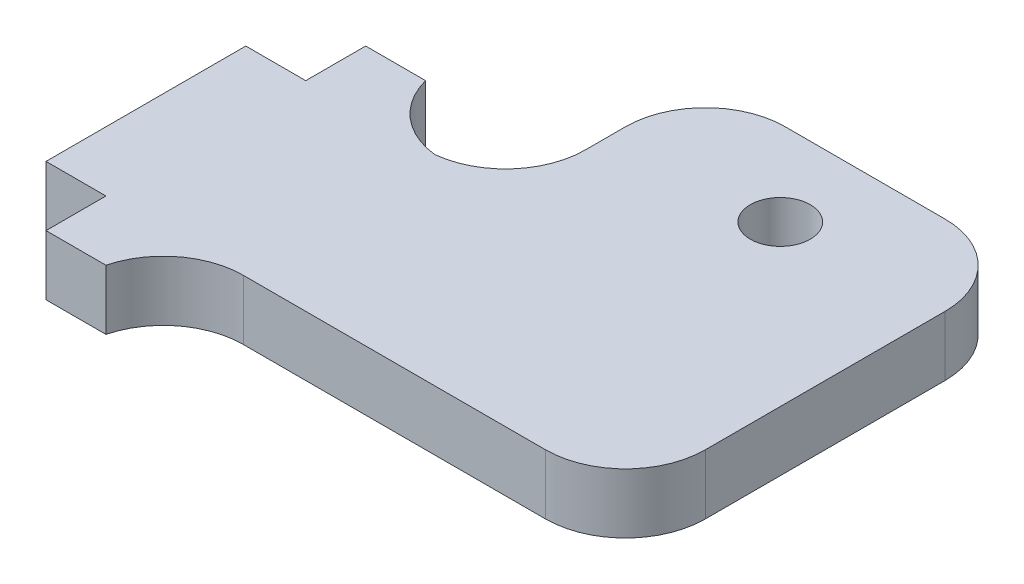
ISO-10303-21;
HEADER;
FILE_DESCRIPTION(('STEP AP214'),'2;1');
FILE_NAME('part.step','',(''),(''),'','','');
FILE_SCHEMA(('AUTOMOTIVE_DESIGN { 1 0 10303 214 1 1 1 1 }'));
ENDSEC;
DATA;
#1=APPLICATION_CONTEXT('core data for automotive mechanical design processes');
#2=APPLICATION_PROTOCOL_DEFINITION('international standard','automotive_design',2000,#1);
#3=PRODUCT_CONTEXT('',#1,'mechanical');
#4=PRODUCT('Part','Part','',(#3));
#5=PRODUCT_RELATED_PRODUCT_CATEGORY('part','',(#4));
#6=PRODUCT_DEFINITION_FORMATION('','',#4);
#7=PRODUCT_DEFINITION_CONTEXT('part definition',#1,'design');
#8=PRODUCT_DEFINITION('design','',#6,#7);
#9=PRODUCT_DEFINITION_SHAPE('','',#8);
#10=(LENGTH_UNIT() NAMED_UNIT(*) SI_UNIT(.MILLI.,.METRE.));
#11=(NAMED_UNIT(*) PLANE_ANGLE_UNIT() SI_UNIT($,.RADIAN.));
#12=(NAMED_UNIT(*) SI_UNIT($,.STERADIAN.) SOLID_ANGLE_UNIT());
#13=UNCERTAINTY_MEASURE_WITH_UNIT(LENGTH_MEASURE(1.E-05),#10,'distance_accuracy_value','');
#14=(GEOMETRIC_REPRESENTATION_CONTEXT(3) GLOBAL_UNCERTAINTY_ASSIGNED_CONTEXT((#13)) GLOBAL_UNIT_ASSIGNED_CONTEXT((#10,
#11,#12)) REPRESENTATION_CONTEXT('',''));
#15=CARTESIAN_POINT('',(0.,0.,0.));
#16=DIRECTION('',(0.,0.,1.));
#17=DIRECTION('',(1.,0.,0.));
#18=AXIS2_PLACEMENT_3D('',#15,#16,#17);
#19=CARTESIAN_POINT('',(-1.5,3.,0.));
#20=DIRECTION('',(1.,0.,0.));
#21=DIRECTION('',(0.,0.,-1.));
#22=AXIS2_PLACEMENT_3D('',#19,#20,#21);
#23=PLANE('',#22);
#24=DIRECTION('',(0.,0.,1.));
#25=VECTOR('',#24,1.);
#26=CARTESIAN_POINT('',(-1.5,0.,0.));
#27=LINE('',#26,#25);
#28=CARTESIAN_POINT('',(-1.5,0.,-6.));
#29=VERTEX_POINT('',#28);
#30=CARTESIAN_POINT('',(-1.5,0.,-4.));
#31=VERTEX_POINT('',#30);
#32=EDGE_CURVE('E246',#29,#31,#27,.T.);
#33=ORIENTED_EDGE('',*,*,#32,.T.);
#34=DIRECTION('',(0.,-1.,0.));
#35=VECTOR('',#34,1.);
#36=CARTESIAN_POINT('',(-1.5,3.,-4.));
#37=LINE('',#36,#35);
#38=CARTESIAN_POINT('',(-1.5,3.,-4.));
#39=VERTEX_POINT('',#38);
#40=EDGE_CURVE('E291',#31,#39,#37,.F.);
#41=ORIENTED_EDGE('',*,*,#40,.T.);
#42=DIRECTION('',(0.,0.,1.));
#43=VECTOR('',#42,1.);
#44=CARTESIAN_POINT('',(-1.5,3.,0.));
#45=LINE('',#44,#43);
#46=CARTESIAN_POINT('',(-1.5,3.,-6.));
#47=VERTEX_POINT('',#46);
#48=EDGE_CURVE('E222',#47,#39,#45,.T.);
#49=ORIENTED_EDGE('',*,*,#48,.F.);
#50=DIRECTION('',(0.,-1.,0.));
#51=VECTOR('',#50,1.);
#52=CARTESIAN_POINT('',(-1.5,0.,-6.));
#53=LINE('',#52,#51);
#54=EDGE_CURVE('E276',#47,#29,#53,.T.);
#55=ORIENTED_EDGE('',*,*,#54,.T.);
#56=EDGE_LOOP('',(#33,#41,#49,#55));
#57=FACE_BOUND('',#56,.T.);
#58=ADVANCED_FACE('F75',(#57),#23,.F.);
#59=CARTESIAN_POINT('',(0.,3.,0.));
#60=DIRECTION('',(0.,0.,-1.));
#61=DIRECTION('',(-1.,0.,0.));
#62=AXIS2_PLACEMENT_3D('',#59,#60,#61);
#63=PLANE('',#62);
#64=DIRECTION('',(1.,0.,0.));
#65=VECTOR('',#64,1.);
#66=CARTESIAN_POINT('',(0.,3.,0.));
#67=LINE('',#66,#65);
#68=CARTESIAN_POINT('',(-14.5,3.,0.));
#69=VERTEX_POINT('',#68);
#70=CARTESIAN_POINT('',(-11.5,3.,0.));
#71=VERTEX_POINT('',#70);
#72=EDGE_CURVE('E199',#69,#71,#67,.T.);
#73=ORIENTED_EDGE('',*,*,#72,.T.);
#74=DIRECTION('',(0.,-1.,0.));
#75=VECTOR('',#74,1.);
#76=CARTESIAN_POINT('',(-11.5,3.,0.));
#77=LINE('',#76,#75);
#78=CARTESIAN_POINT('',(-11.5,0.,0.));
#79=VERTEX_POINT('',#78);
#80=EDGE_CURVE('E205',#71,#79,#77,.T.);
#81=ORIENTED_EDGE('',*,*,#80,.T.);
#82=DIRECTION('',(1.,0.,0.));
#83=VECTOR('',#82,1.);
#84=CARTESIAN_POINT('',(0.,0.,0.));
#85=LINE('',#84,#83);
#86=CARTESIAN_POINT('',(-14.5,0.,0.));
#87=VERTEX_POINT('',#86);
#88=EDGE_CURVE('E201',#87,#79,#85,.T.);
#89=ORIENTED_EDGE('',*,*,#88,.F.);
#90=DIRECTION('',(0.,-1.,0.));
#91=VECTOR('',#90,1.);
#92=CARTESIAN_POINT('',(-14.5,3.,0.));
#93=LINE('',#92,#91);
#94=EDGE_CURVE('E195',#69,#87,#93,.T.);
#95=ORIENTED_EDGE('',*,*,#94,.F.);
#96=EDGE_LOOP('',(#73,#81,#89,#95));
#97=FACE_BOUND('',#96,.T.);
#98=ADVANCED_FACE('F197',(#97),#63,.T.);
#99=CARTESIAN_POINT('',(-14.5,3.,0.));
#100=DIRECTION('',(1.,0.,0.));
#101=DIRECTION('',(0.,0.,-1.));
#102=AXIS2_PLACEMENT_3D('',#99,#100,#101);
#103=PLANE('',#102);
#104=DIRECTION('',(0.,0.,1.));
#105=VECTOR('',#104,1.);
#106=CARTESIAN_POINT('',(-14.5,0.,0.));
#107=LINE('',#106,#105);
#108=CARTESIAN_POINT('',(-14.5,0.,10.));
#109=VERTEX_POINT('',#108);
#110=EDGE_CURVE('E250',#87,#109,#107,.T.);
#111=ORIENTED_EDGE('',*,*,#110,.T.);
#112=DIRECTION('',(0.,-1.,0.));
#113=VECTOR('',#112,1.);
#114=CARTESIAN_POINT('',(-14.5,3.,10.));
#115=LINE('',#114,#113);
#116=CARTESIAN_POINT('',(-14.5,3.,10.));
#117=VERTEX_POINT('',#116);
#118=EDGE_CURVE('E206',#117,#109,#115,.T.);
#119=ORIENTED_EDGE('',*,*,#118,.F.);
#120=DIRECTION('',(0.,0.,1.));
#121=VECTOR('',#120,1.);
#122=CARTESIAN_POINT('',(-14.5,3.,0.));
#123=LINE('',#122,#121);
#124=EDGE_CURVE('E210',#69,#117,#123,.T.);
#125=ORIENTED_EDGE('',*,*,#124,.F.);
#126=ORIENTED_EDGE('',*,*,#94,.T.);
#127=EDGE_LOOP('',(#111,#119,#125,#126));
#128=FACE_BOUND('',#127,.T.);
#129=ADVANCED_FACE('F211',(#128),#103,.F.);
#130=CARTESIAN_POINT('',(0.,3.,10.));
#131=DIRECTION('',(0.,0.,-1.));
#132=DIRECTION('',(-1.,0.,0.));
#133=AXIS2_PLACEMENT_3D('',#130,#131,#132);
#134=PLANE('',#133);
#135=DIRECTION('',(1.,0.,0.));
#136=VECTOR('',#135,1.);
#137=CARTESIAN_POINT('',(0.,0.,10.));
#138=LINE('',#137,#136);
#139=CARTESIAN_POINT('',(-11.5,0.,10.));
#140=VERTEX_POINT('',#139);
#141=EDGE_CURVE('E252',#109,#140,#138,.T.);
#142=ORIENTED_EDGE('',*,*,#141,.T.);
#143=DIRECTION('',(0.,-1.,0.));
#144=VECTOR('',#143,1.);
#145=CARTESIAN_POINT('',(-11.5,3.,10.));
#146=LINE('',#145,#144);
#147=CARTESIAN_POINT('',(-11.5,3.,10.));
#148=VERTEX_POINT('',#147);
#149=EDGE_CURVE('E271',#148,#140,#146,.T.);
#150=ORIENTED_EDGE('',*,*,#149,.F.);
#151=DIRECTION('',(1.,0.,0.));
#152=VECTOR('',#151,1.);
#153=CARTESIAN_POINT('',(0.,3.,10.));
#154=LINE('',#153,#152);
#155=EDGE_CURVE('E214',#117,#148,#154,.T.);
#156=ORIENTED_EDGE('',*,*,#155,.F.);
#157=ORIENTED_EDGE('',*,*,#118,.T.);
#158=EDGE_LOOP('',(#142,#150,#156,#157));
#159=FACE_BOUND('',#158,.T.);
#160=ADVANCED_FACE('F426',(#159),#134,.F.);
#161=CARTESIAN_POINT('',(-11.5,3.,0.));
#162=DIRECTION('',(1.,0.,0.));
#163=DIRECTION('',(0.,0.,-1.));
#164=AXIS2_PLACEMENT_3D('',#161,#162,#163);
#165=PLANE('',#164);
#166=DIRECTION('',(0.,0.,1.));
#167=VECTOR('',#166,1.);
#168=CARTESIAN_POINT('',(-11.5,0.,0.));
#169=LINE('',#168,#167);
#170=CARTESIAN_POINT('',(-11.5,0.,13.));
#171=VERTEX_POINT('',#170);
#172=EDGE_CURVE('E255',#140,#171,#169,.T.);
#173=ORIENTED_EDGE('',*,*,#172,.T.);
#174=DIRECTION('',(0.,-1.,0.));
#175=VECTOR('',#174,1.);
#176=CARTESIAN_POINT('',(-11.5,3.,13.));
#177=LINE('',#176,#175);
#178=CARTESIAN_POINT('',(-11.5,3.,13.));
#179=VERTEX_POINT('',#178);
#180=EDGE_CURVE('E268',#179,#171,#177,.T.);
#181=ORIENTED_EDGE('',*,*,#180,.F.);
#182=DIRECTION('',(0.,0.,1.));
#183=VECTOR('',#182,1.);
#184=CARTESIAN_POINT('',(-11.5,3.,0.));
#185=LINE('',#184,#183);
#186=EDGE_CURVE('E229',#148,#179,#185,.T.);
#187=ORIENTED_EDGE('',*,*,#186,.F.);
#188=ORIENTED_EDGE('',*,*,#149,.T.);
#189=EDGE_LOOP('',(#173,#181,#187,#188));
#190=FACE_BOUND('',#189,.T.);
#191=ADVANCED_FACE('F428',(#190),#165,.F.);
#192=CARTESIAN_POINT('',(0.,3.,13.));
#193=DIRECTION('',(0.,0.,-1.));
#194=DIRECTION('',(-1.,0.,0.));
#195=AXIS2_PLACEMENT_3D('',#192,#193,#194);
#196=PLANE('',#195);
#197=DIRECTION('',(1.,0.,0.));
#198=VECTOR('',#197,1.);
#199=CARTESIAN_POINT('',(0.,0.,13.));
#200=LINE('',#199,#198);
#201=CARTESIAN_POINT('',(-8.5,0.,13.));
#202=VERTEX_POINT('',#201);
#203=EDGE_CURVE('E259',#171,#202,#200,.T.);
#204=ORIENTED_EDGE('',*,*,#203,.T.);
#205=DIRECTION('',(0.,-1.,0.));
#206=VECTOR('',#205,1.);
#207=CARTESIAN_POINT('',(-8.5,3.,13.));
#208=LINE('',#207,#206);
#209=CARTESIAN_POINT('',(-8.5,3.,13.));
#210=VERTEX_POINT('',#209);
#211=EDGE_CURVE('E238',#210,#202,#208,.T.);
#212=ORIENTED_EDGE('',*,*,#211,.F.);
#213=DIRECTION('',(1.,0.,0.));
#214=VECTOR('',#213,1.);
#215=CARTESIAN_POINT('',(0.,3.,13.));
#216=LINE('',#215,#214);
#217=EDGE_CURVE('E233',#179,#210,#216,.T.);
#218=ORIENTED_EDGE('',*,*,#217,.F.);
#219=ORIENTED_EDGE('',*,*,#180,.T.);
#220=EDGE_LOOP('',(#204,#212,#218,#219));
#221=FACE_BOUND('',#220,.T.);
#222=ADVANCED_FACE('F334',(#221),#196,.F.);
#223=CARTESIAN_POINT('',(-4.62701665379258,3.,10.));
#224=VERTEX_POINT('',#223);
#225=CARTESIAN_POINT('',(10.5,3.,10.));
#226=VERTEX_POINT('',#225);
#227=EDGE_CURVE('E230',#224,#226,#154,.T.);
#228=ORIENTED_EDGE('',*,*,#227,.F.);
#229=DIRECTION('',(0.,1.,0.));
#230=VECTOR('',#229,1.);
#231=CARTESIAN_POINT('',(-4.62701665379258,3.,10.));
#232=LINE('',#231,#230);
#233=CARTESIAN_POINT('',(-4.62701665379258,0.,10.));
#234=VERTEX_POINT('',#233);
#235=EDGE_CURVE('E296',#224,#234,#232,.F.);
#236=ORIENTED_EDGE('',*,*,#235,.T.);
#237=CARTESIAN_POINT('',(10.5,0.,10.));
#238=VERTEX_POINT('',#237);
#239=EDGE_CURVE('E256',#234,#238,#138,.T.);
#240=ORIENTED_EDGE('',*,*,#239,.T.);
#241=DIRECTION('',(0.,-1.,0.));
#242=VECTOR('',#241,1.);
#243=CARTESIAN_POINT('',(10.5,3.,10.));
#244=LINE('',#243,#242);
#245=EDGE_CURVE('E294',#238,#226,#244,.F.);
#246=ORIENTED_EDGE('',*,*,#245,.T.);
#247=EDGE_LOOP('',(#228,#236,#240,#246));
#248=FACE_BOUND('',#247,.T.);
#249=ADVANCED_FACE('F341',(#248),#134,.F.);
#250=CARTESIAN_POINT('',(14.5,3.,0.));
#251=DIRECTION('',(1.,0.,0.));
#252=DIRECTION('',(0.,0.,-1.));
#253=AXIS2_PLACEMENT_3D('',#250,#251,#252);
#254=PLANE('',#253);
#255=DIRECTION('',(0.,0.,1.));
#256=VECTOR('',#255,1.);
#257=CARTESIAN_POINT('',(14.5,3.,0.));
#258=LINE('',#257,#256);
#259=CARTESIAN_POINT('',(14.5,3.,-6.));
#260=VERTEX_POINT('',#259);
#261=CARTESIAN_POINT('',(14.5,3.,6.));
#262=VERTEX_POINT('',#261);
#263=EDGE_CURVE('E235',#260,#262,#258,.T.);
#264=ORIENTED_EDGE('',*,*,#263,.T.);
#265=DIRECTION('',(0.,-1.,0.));
#266=VECTOR('',#265,1.);
#267=CARTESIAN_POINT('',(14.5,0.,6.));
#268=LINE('',#267,#266);
#269=CARTESIAN_POINT('',(14.5,0.,6.));
#270=VERTEX_POINT('',#269);
#271=EDGE_CURVE('E301',#262,#270,#268,.T.);
#272=ORIENTED_EDGE('',*,*,#271,.T.);
#273=DIRECTION('',(0.,0.,1.));
#274=VECTOR('',#273,1.);
#275=CARTESIAN_POINT('',(14.5,0.,0.));
#276=LINE('',#275,#274);
#277=CARTESIAN_POINT('',(14.5,0.,-6.));
#278=VERTEX_POINT('',#277);
#279=EDGE_CURVE('E262',#278,#270,#276,.T.);
#280=ORIENTED_EDGE('',*,*,#279,.F.);
#281=DIRECTION('',(0.,-1.,0.));
#282=VECTOR('',#281,1.);
#283=CARTESIAN_POINT('',(14.5,3.,-6.));
#284=LINE('',#283,#282);
#285=EDGE_CURVE('E299',#278,#260,#284,.F.);
#286=ORIENTED_EDGE('',*,*,#285,.T.);
#287=EDGE_LOOP('',(#264,#272,#280,#286));
#288=FACE_BOUND('',#287,.T.);
#289=ADVANCED_FACE('F349',(#288),#254,.T.);
#290=CARTESIAN_POINT('',(0.,3.,-10.));
#291=DIRECTION('',(0.,0.,-1.));
#292=DIRECTION('',(-1.,0.,0.));
#293=AXIS2_PLACEMENT_3D('',#290,#291,#292);
#294=PLANE('',#293);
#295=DIRECTION('',(1.,0.,0.));
#296=VECTOR('',#295,1.);
#297=CARTESIAN_POINT('',(0.,3.,-10.));
#298=LINE('',#297,#296);
#299=CARTESIAN_POINT('',(2.5,3.,-10.));
#300=VERTEX_POINT('',#299);
#301=CARTESIAN_POINT('',(10.5,3.,-10.));
#302=VERTEX_POINT('',#301);
#303=EDGE_CURVE('E224',#300,#302,#298,.T.);
#304=ORIENTED_EDGE('',*,*,#303,.T.);
#305=DIRECTION('',(0.,-1.,0.));
#306=VECTOR('',#305,1.);
#307=CARTESIAN_POINT('',(10.5,3.,-10.));
#308=LINE('',#307,#306);
#309=CARTESIAN_POINT('',(10.5,0.,-10.));
#310=VERTEX_POINT('',#309);
#311=EDGE_CURVE('E318',#302,#310,#308,.T.);
#312=ORIENTED_EDGE('',*,*,#311,.T.);
#313=DIRECTION('',(1.,0.,0.));
#314=VECTOR('',#313,1.);
#315=CARTESIAN_POINT('',(0.,0.,-10.));
#316=LINE('',#315,#314);
#317=CARTESIAN_POINT('',(2.5,0.,-10.));
#318=VERTEX_POINT('',#317);
#319=EDGE_CURVE('E242',#318,#310,#316,.T.);
#320=ORIENTED_EDGE('',*,*,#319,.F.);
#321=DIRECTION('',(0.,-1.,0.));
#322=VECTOR('',#321,1.);
#323=CARTESIAN_POINT('',(2.5,3.,-10.));
#324=LINE('',#323,#322);
#325=EDGE_CURVE('E316',#318,#300,#324,.F.);
#326=ORIENTED_EDGE('',*,*,#325,.T.);
#327=EDGE_LOOP('',(#304,#312,#320,#326));
#328=FACE_BOUND('',#327,.T.);
#329=ADVANCED_FACE('F359',(#328),#294,.T.);
#330=CARTESIAN_POINT('',(6.5,3.,-5.75));
#331=DIRECTION('',(0.,-1.,0.));
#332=DIRECTION('',(0.,0.,-1.));
#333=AXIS2_PLACEMENT_3D('',#330,#331,#332);
#334=CYLINDRICAL_SURFACE('',#333,1.5);
#335=CARTESIAN_POINT('',(6.5,3.,-5.75));
#336=DIRECTION('',(0.,1.,0.));
#337=DIRECTION('',(0.,0.,1.));
#338=AXIS2_PLACEMENT_3D('',#335,#336,#337);
#339=CIRCLE('',#338,1.5);
#340=CARTESIAN_POINT('',(6.5,3.,-4.25));
#341=VERTEX_POINT('',#340);
#342=EDGE_CURVE('E265',#341,#341,#339,.T.);
#343=ORIENTED_EDGE('',*,*,#342,.T.);
#344=EDGE_LOOP('',(#343));
#345=FACE_BOUND('',#344,.T.);
#346=CARTESIAN_POINT('',(6.5,0.,-5.75));
#347=DIRECTION('',(0.,1.,0.));
#348=DIRECTION('',(0.,0.,1.));
#349=AXIS2_PLACEMENT_3D('',#346,#347,#348);
#350=CIRCLE('',#349,1.5);
#351=CARTESIAN_POINT('',(6.5,0.,-4.25));
#352=VERTEX_POINT('',#351);
#353=EDGE_CURVE('E239',#352,#352,#350,.T.);
#354=ORIENTED_EDGE('',*,*,#353,.F.);
#355=EDGE_LOOP('',(#354));
#356=FACE_BOUND('',#355,.T.);
#357=ADVANCED_FACE('F366',(#345,#356),#334,.F.);
#358=CARTESIAN_POINT('',(0.,0.,0.));
#359=DIRECTION('',(0.,1.,0.));
#360=DIRECTION('',(0.,0.,1.));
#361=AXIS2_PLACEMENT_3D('',#358,#359,#360);
#362=PLANE('',#361);
#363=ORIENTED_EDGE('',*,*,#353,.T.);
#364=EDGE_LOOP('',(#363));
#365=FACE_BOUND('',#364,.T.);
#366=ORIENTED_EDGE('',*,*,#279,.T.);
#367=CARTESIAN_POINT('',(10.5,0.,6.));
#368=DIRECTION('',(0.,1.,0.));
#369=DIRECTION('',(0.,0.,1.));
#370=AXIS2_PLACEMENT_3D('',#367,#368,#369);
#371=CIRCLE('',#370,4.);
#372=EDGE_CURVE('E308',#270,#238,#371,.F.);
#373=ORIENTED_EDGE('',*,*,#372,.T.);
#374=ORIENTED_EDGE('',*,*,#239,.F.);
#375=CARTESIAN_POINT('',(-4.62701665379258,0.,14.));
#376=DIRECTION('',(0.,1.,0.));
#377=DIRECTION('',(0.,0.,1.));
#378=AXIS2_PLACEMENT_3D('',#375,#376,#377);
#379=CIRCLE('',#378,4.);
#380=EDGE_CURVE('E84',#234,#202,#379,.T.);
#381=ORIENTED_EDGE('',*,*,#380,.T.);
#382=ORIENTED_EDGE('',*,*,#203,.F.);
#383=ORIENTED_EDGE('',*,*,#172,.F.);
#384=ORIENTED_EDGE('',*,*,#141,.F.);
#385=ORIENTED_EDGE('',*,*,#110,.F.);
#386=ORIENTED_EDGE('',*,*,#88,.T.);
#387=DIRECTION('',(0.,0.,1.));
#388=VECTOR('',#387,1.);
#389=CARTESIAN_POINT('',(-11.5,0.,-3.));
#390=LINE('',#389,#388);
#391=CARTESIAN_POINT('',(-11.5,0.,-3.));
#392=VERTEX_POINT('',#391);
#393=EDGE_CURVE('E283',#392,#79,#390,.T.);
#394=ORIENTED_EDGE('',*,*,#393,.F.);
#395=DIRECTION('',(1.,0.,0.));
#396=VECTOR('',#395,1.);
#397=CARTESIAN_POINT('',(-11.5,0.,-3.));
#398=LINE('',#397,#396);
#399=CARTESIAN_POINT('',(-8.5,0.,-3.));
#400=VERTEX_POINT('',#399);
#401=EDGE_CURVE('E279',#392,#400,#398,.T.);
#402=ORIENTED_EDGE('',*,*,#401,.T.);
#403=CARTESIAN_POINT('',(-4.62701665379258,0.,-4.));
#404=DIRECTION('',(0.,1.,0.));
#405=DIRECTION('',(0.,0.,1.));
#406=AXIS2_PLACEMENT_3D('',#403,#404,#405);
#407=CIRCLE('',#406,4.);
#408=CARTESIAN_POINT('',(-5.06350832689629,0.,-0.023886945858918));
#409=VERTEX_POINT('',#408);
#410=EDGE_CURVE('E99',#400,#409,#407,.T.);
#411=ORIENTED_EDGE('',*,*,#410,.T.);
#412=CARTESIAN_POINT('',(-5.5,0.,-4.));
#413=DIRECTION('',(0.,1.,0.));
#414=DIRECTION('',(0.,0.,1.));
#415=AXIS2_PLACEMENT_3D('',#412,#413,#414);
#416=CIRCLE('',#415,4.);
#417=EDGE_CURVE('E321',#409,#31,#416,.T.);
#418=ORIENTED_EDGE('',*,*,#417,.T.);
#419=ORIENTED_EDGE('',*,*,#32,.F.);
#420=CARTESIAN_POINT('',(2.5,0.,-6.));
#421=DIRECTION('',(0.,1.,0.));
#422=DIRECTION('',(0.,0.,1.));
#423=AXIS2_PLACEMENT_3D('',#420,#421,#422);
#424=CIRCLE('',#423,4.);
#425=EDGE_CURVE('E304',#29,#318,#424,.F.);
#426=ORIENTED_EDGE('',*,*,#425,.T.);
#427=ORIENTED_EDGE('',*,*,#319,.T.);
#428=CARTESIAN_POINT('',(10.5,0.,-6.));
#429=DIRECTION('',(0.,1.,0.));
#430=DIRECTION('',(0.,0.,1.));
#431=AXIS2_PLACEMENT_3D('',#428,#429,#430);
#432=CIRCLE('',#431,4.);
#433=EDGE_CURVE('E306',#310,#278,#432,.F.);
#434=ORIENTED_EDGE('',*,*,#433,.T.);
#435=EDGE_LOOP('',(#366,#373,#374,#381,#382,#383,#384,#385,#386,#394,#402,#411,#418,#419,#426,
#427,#434));
#436=FACE_BOUND('',#435,.T.);
#437=ADVANCED_FACE('F328',(#365,#436),#362,.F.);
#438=CARTESIAN_POINT('',(0.,3.,0.));
#439=DIRECTION('',(0.,1.,0.));
#440=DIRECTION('',(0.,0.,1.));
#441=AXIS2_PLACEMENT_3D('',#438,#439,#440);
#442=PLANE('',#441);
#443=ORIENTED_EDGE('',*,*,#342,.F.);
#444=EDGE_LOOP('',(#443));
#445=FACE_BOUND('',#444,.T.);
#446=ORIENTED_EDGE('',*,*,#227,.T.);
#447=CARTESIAN_POINT('',(10.5,3.,6.));
#448=DIRECTION('',(0.,1.,0.));
#449=DIRECTION('',(0.,0.,1.));
#450=AXIS2_PLACEMENT_3D('',#447,#448,#449);
#451=CIRCLE('',#450,4.);
#452=EDGE_CURVE('E314',#226,#262,#451,.T.);
#453=ORIENTED_EDGE('',*,*,#452,.T.);
#454=ORIENTED_EDGE('',*,*,#263,.F.);
#455=CARTESIAN_POINT('',(10.5,3.,-6.));
#456=DIRECTION('',(0.,1.,0.));
#457=DIRECTION('',(0.,0.,1.));
#458=AXIS2_PLACEMENT_3D('',#455,#456,#457);
#459=CIRCLE('',#458,4.);
#460=EDGE_CURVE('E312',#260,#302,#459,.T.);
#461=ORIENTED_EDGE('',*,*,#460,.T.);
#462=ORIENTED_EDGE('',*,*,#303,.F.);
#463=CARTESIAN_POINT('',(2.5,3.,-6.));
#464=DIRECTION('',(0.,1.,0.));
#465=DIRECTION('',(0.,0.,1.));
#466=AXIS2_PLACEMENT_3D('',#463,#464,#465);
#467=CIRCLE('',#466,4.);
#468=EDGE_CURVE('E310',#300,#47,#467,.T.);
#469=ORIENTED_EDGE('',*,*,#468,.T.);
#470=ORIENTED_EDGE('',*,*,#48,.T.);
#471=CARTESIAN_POINT('',(-5.5,3.,-4.));
#472=DIRECTION('',(0.,1.,0.));
#473=DIRECTION('',(0.,0.,1.));
#474=AXIS2_PLACEMENT_3D('',#471,#472,#473);
#475=CIRCLE('',#474,4.);
#476=CARTESIAN_POINT('',(-5.06350832689629,3.,-0.023886945858918));
#477=VERTEX_POINT('',#476);
#478=EDGE_CURVE('E91',#39,#477,#475,.F.);
#479=ORIENTED_EDGE('',*,*,#478,.T.);
#480=CARTESIAN_POINT('',(-4.62701665379258,3.,-4.));
#481=DIRECTION('',(0.,1.,0.));
#482=DIRECTION('',(0.,0.,1.));
#483=AXIS2_PLACEMENT_3D('',#480,#481,#482);
#484=CIRCLE('',#483,4.);
#485=CARTESIAN_POINT('',(-8.5,3.,-3.));
#486=VERTEX_POINT('',#485);
#487=EDGE_CURVE('E325',#477,#486,#484,.F.);
#488=ORIENTED_EDGE('',*,*,#487,.T.);
#489=DIRECTION('',(1.,0.,0.));
#490=VECTOR('',#489,1.);
#491=CARTESIAN_POINT('',(-11.5,3.,-3.));
#492=LINE('',#491,#490);
#493=CARTESIAN_POINT('',(-11.5,3.,-3.));
#494=VERTEX_POINT('',#493);
#495=EDGE_CURVE('E278',#494,#486,#492,.T.);
#496=ORIENTED_EDGE('',*,*,#495,.F.);
#497=DIRECTION('',(0.,0.,1.));
#498=VECTOR('',#497,1.);
#499=CARTESIAN_POINT('',(-11.5,3.,-3.));
#500=LINE('',#499,#498);
#501=EDGE_CURVE('E221',#494,#71,#500,.T.);
#502=ORIENTED_EDGE('',*,*,#501,.T.);
#503=ORIENTED_EDGE('',*,*,#72,.F.);
#504=ORIENTED_EDGE('',*,*,#124,.T.);
#505=ORIENTED_EDGE('',*,*,#155,.T.);
#506=ORIENTED_EDGE('',*,*,#186,.T.);
#507=ORIENTED_EDGE('',*,*,#217,.T.);
#508=CARTESIAN_POINT('',(-4.62701665379258,3.,14.));
#509=DIRECTION('',(0.,1.,0.));
#510=DIRECTION('',(0.,0.,1.));
#511=AXIS2_PLACEMENT_3D('',#508,#509,#510);
#512=CIRCLE('',#511,4.);
#513=EDGE_CURVE('E12',#210,#224,#512,.F.);
#514=ORIENTED_EDGE('',*,*,#513,.T.);
#515=EDGE_LOOP('',(#446,#453,#454,#461,#462,#469,#470,#479,#488,#496,#502,#503,#504,#505,#506,
#507,#514));
#516=FACE_BOUND('',#515,.T.);
#517=ADVANCED_FACE('F218',(#445,#516),#442,.T.);
#518=CARTESIAN_POINT('',(-11.5,3.,-3.));
#519=DIRECTION('',(0.,0.,-1.));
#520=DIRECTION('',(-1.,0.,0.));
#521=AXIS2_PLACEMENT_3D('',#518,#519,#520);
#522=PLANE('',#521);
#523=ORIENTED_EDGE('',*,*,#401,.F.);
#524=DIRECTION('',(0.,-1.,0.));
#525=VECTOR('',#524,1.);
#526=CARTESIAN_POINT('',(-11.5,3.,-3.));
#527=LINE('',#526,#525);
#528=EDGE_CURVE('E282',#494,#392,#527,.T.);
#529=ORIENTED_EDGE('',*,*,#528,.F.);
#530=ORIENTED_EDGE('',*,*,#495,.T.);
#531=DIRECTION('',(0.,-1.,0.));
#532=VECTOR('',#531,1.);
#533=CARTESIAN_POINT('',(-8.5,3.,-3.));
#534=LINE('',#533,#532);
#535=EDGE_CURVE('E243',#486,#400,#534,.T.);
#536=ORIENTED_EDGE('',*,*,#535,.T.);
#537=EDGE_LOOP('',(#523,#529,#530,#536));
#538=FACE_BOUND('',#537,.T.);
#539=ADVANCED_FACE('F370',(#538),#522,.T.);
#540=CARTESIAN_POINT('',(-11.5,3.,-3.));
#541=DIRECTION('',(1.,0.,0.));
#542=DIRECTION('',(0.,0.,-1.));
#543=AXIS2_PLACEMENT_3D('',#540,#541,#542);
#544=PLANE('',#543);
#545=ORIENTED_EDGE('',*,*,#393,.T.);
#546=ORIENTED_EDGE('',*,*,#80,.F.);
#547=ORIENTED_EDGE('',*,*,#501,.F.);
#548=ORIENTED_EDGE('',*,*,#528,.T.);
#549=EDGE_LOOP('',(#545,#546,#547,#548));
#550=FACE_BOUND('',#549,.T.);
#551=ADVANCED_FACE('F372',(#550),#544,.F.);
#552=CARTESIAN_POINT('',(-4.62701665379258,3.,-4.));
#553=DIRECTION('',(0.,1.,0.));
#554=DIRECTION('',(0.,0.,1.));
#555=AXIS2_PLACEMENT_3D('',#552,#553,#554);
#556=CYLINDRICAL_SURFACE('',#555,4.);
#557=ORIENTED_EDGE('',*,*,#535,.F.);
#558=ORIENTED_EDGE('',*,*,#487,.F.);
#559=DIRECTION('',(0.,1.,0.));
#560=VECTOR('',#559,1.);
#561=CARTESIAN_POINT('',(-5.06350832689629,1.5,-0.023886945858918));
#562=LINE('',#561,#560);
#563=EDGE_CURVE('E79',#409,#477,#562,.T.);
#564=ORIENTED_EDGE('',*,*,#563,.F.);
#565=ORIENTED_EDGE('',*,*,#410,.F.);
#566=EDGE_LOOP('',(#557,#558,#564,#565));
#567=FACE_BOUND('',#566,.T.);
#568=ADVANCED_FACE('F379',(#567),#556,.F.);
#569=CARTESIAN_POINT('',(-5.5,3.,-4.));
#570=DIRECTION('',(0.,-1.,0.));
#571=DIRECTION('',(0.,0.,-1.));
#572=AXIS2_PLACEMENT_3D('',#569,#570,#571);
#573=CYLINDRICAL_SURFACE('',#572,4.);
#574=ORIENTED_EDGE('',*,*,#478,.F.);
#575=ORIENTED_EDGE('',*,*,#40,.F.);
#576=ORIENTED_EDGE('',*,*,#417,.F.);
#577=ORIENTED_EDGE('',*,*,#563,.T.);
#578=EDGE_LOOP('',(#574,#575,#576,#577));
#579=FACE_BOUND('',#578,.T.);
#580=ADVANCED_FACE('F398',(#579),#573,.F.);
#581=CARTESIAN_POINT('',(-4.62701665379258,3.,14.));
#582=DIRECTION('',(0.,1.,0.));
#583=DIRECTION('',(0.,0.,1.));
#584=AXIS2_PLACEMENT_3D('',#581,#582,#583);
#585=CYLINDRICAL_SURFACE('',#584,4.);
#586=ORIENTED_EDGE('',*,*,#513,.F.);
#587=ORIENTED_EDGE('',*,*,#211,.T.);
#588=ORIENTED_EDGE('',*,*,#380,.F.);
#589=ORIENTED_EDGE('',*,*,#235,.F.);
#590=EDGE_LOOP('',(#586,#587,#588,#589));
#591=FACE_BOUND('',#590,.T.);
#592=ADVANCED_FACE('F337',(#591),#585,.F.);
#593=CARTESIAN_POINT('',(10.5,3.,6.));
#594=DIRECTION('',(0.,1.,0.));
#595=DIRECTION('',(0.,0.,1.));
#596=AXIS2_PLACEMENT_3D('',#593,#594,#595);
#597=CYLINDRICAL_SURFACE('',#596,4.);
#598=ORIENTED_EDGE('',*,*,#452,.F.);
#599=ORIENTED_EDGE('',*,*,#245,.F.);
#600=ORIENTED_EDGE('',*,*,#372,.F.);
#601=ORIENTED_EDGE('',*,*,#271,.F.);
#602=EDGE_LOOP('',(#598,#599,#600,#601));
#603=FACE_BOUND('',#602,.T.);
#604=ADVANCED_FACE('F344',(#603),#597,.T.);
#605=CARTESIAN_POINT('',(10.5,3.,-6.));
#606=DIRECTION('',(0.,-1.,0.));
#607=DIRECTION('',(0.,0.,-1.));
#608=AXIS2_PLACEMENT_3D('',#605,#606,#607);
#609=CYLINDRICAL_SURFACE('',#608,4.);
#610=ORIENTED_EDGE('',*,*,#460,.F.);
#611=ORIENTED_EDGE('',*,*,#285,.F.);
#612=ORIENTED_EDGE('',*,*,#433,.F.);
#613=ORIENTED_EDGE('',*,*,#311,.F.);
#614=EDGE_LOOP('',(#610,#611,#612,#613));
#615=FACE_BOUND('',#614,.T.);
#616=ADVANCED_FACE('F353',(#615),#609,.T.);
#617=CARTESIAN_POINT('',(2.5,3.,-6.));
#618=DIRECTION('',(0.,1.,0.));
#619=DIRECTION('',(0.,0.,1.));
#620=AXIS2_PLACEMENT_3D('',#617,#618,#619);
#621=CYLINDRICAL_SURFACE('',#620,4.);
#622=ORIENTED_EDGE('',*,*,#468,.F.);
#623=ORIENTED_EDGE('',*,*,#325,.F.);
#624=ORIENTED_EDGE('',*,*,#425,.F.);
#625=ORIENTED_EDGE('',*,*,#54,.F.);
#626=EDGE_LOOP('',(#622,#623,#624,#625));
#627=FACE_BOUND('',#626,.T.);
#628=ADVANCED_FACE('F77',(#627),#621,.T.);
#629=CLOSED_SHELL('',(#58,#98,#129,#160,#191,#222,#249,#289,#329,#357,#437,#517,#539,#551,#568,
#580,#592,#604,#616,#628));
#630=MANIFOLD_SOLID_BREP('B2',#629);
#631=ADVANCED_BREP_SHAPE_REPRESENTATION('',(#18,#630),#14);
#632=SHAPE_DEFINITION_REPRESENTATION(#9,#631);
ENDSEC;
END-ISO-10303-21;
